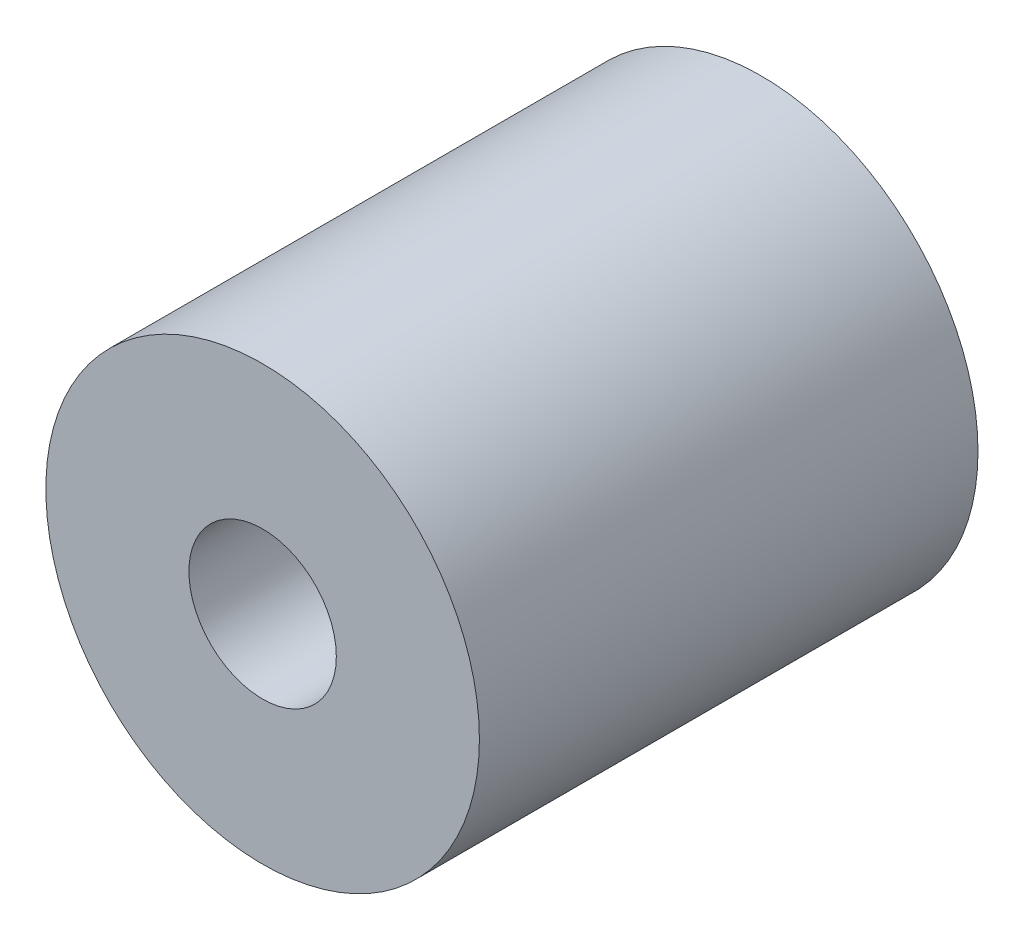
ISO-10303-21;
HEADER;
FILE_DESCRIPTION(('STEP AP214'),'2;1');
FILE_NAME('part.step','',(''),(''),'','','');
FILE_SCHEMA(('AUTOMOTIVE_DESIGN { 1 0 10303 214 1 1 1 1 }'));
ENDSEC;
DATA;
#1=APPLICATION_CONTEXT('core data for automotive mechanical design processes');
#2=APPLICATION_PROTOCOL_DEFINITION('international standard','automotive_design',2000,#1);
#3=PRODUCT_CONTEXT('',#1,'mechanical');
#4=PRODUCT('Part','Part','',(#3));
#5=PRODUCT_RELATED_PRODUCT_CATEGORY('part','',(#4));
#6=PRODUCT_DEFINITION_FORMATION('','',#4);
#7=PRODUCT_DEFINITION_CONTEXT('part definition',#1,'design');
#8=PRODUCT_DEFINITION('design','',#6,#7);
#9=PRODUCT_DEFINITION_SHAPE('','',#8);
#10=(LENGTH_UNIT() NAMED_UNIT(*) SI_UNIT(.MILLI.,.METRE.));
#11=(NAMED_UNIT(*) PLANE_ANGLE_UNIT() SI_UNIT($,.RADIAN.));
#12=(NAMED_UNIT(*) SI_UNIT($,.STERADIAN.) SOLID_ANGLE_UNIT());
#13=UNCERTAINTY_MEASURE_WITH_UNIT(LENGTH_MEASURE(1.E-05),#10,'distance_accuracy_value','');
#14=(GEOMETRIC_REPRESENTATION_CONTEXT(3) GLOBAL_UNCERTAINTY_ASSIGNED_CONTEXT((#13)) GLOBAL_UNIT_ASSIGNED_CONTEXT((#10,
#11,#12)) REPRESENTATION_CONTEXT('',''));
#15=CARTESIAN_POINT('',(0.,0.,0.));
#16=DIRECTION('',(0.,0.,1.));
#17=DIRECTION('',(1.,0.,0.));
#18=AXIS2_PLACEMENT_3D('',#15,#16,#17);
#19=CARTESIAN_POINT('',(0.,0.,11.5));
#20=DIRECTION('',(0.,0.,1.));
#21=DIRECTION('',(1.,0.,0.));
#22=AXIS2_PLACEMENT_3D('',#19,#20,#21);
#23=PLANE('',#22);
#24=CARTESIAN_POINT('',(0.,0.,11.5));
#25=DIRECTION('',(0.,0.,1.));
#26=DIRECTION('',(1.,0.,0.));
#27=AXIS2_PLACEMENT_3D('',#24,#25,#26);
#28=CIRCLE('',#27,5.);
#29=CARTESIAN_POINT('',(5.,0.,11.5));
#30=VERTEX_POINT('',#29);
#31=EDGE_CURVE('E10',#30,#30,#28,.T.);
#32=ORIENTED_EDGE('',*,*,#31,.T.);
#33=EDGE_LOOP('',(#32));
#34=FACE_BOUND('',#33,.T.);
#35=CARTESIAN_POINT('',(0.,0.,11.5));
#36=DIRECTION('',(0.,0.,1.));
#37=DIRECTION('',(1.,0.,0.));
#38=AXIS2_PLACEMENT_3D('',#35,#36,#37);
#39=CIRCLE('',#38,1.7);
#40=CARTESIAN_POINT('',(1.7,0.,11.5));
#41=VERTEX_POINT('',#40);
#42=EDGE_CURVE('E50',#41,#41,#39,.T.);
#43=ORIENTED_EDGE('',*,*,#42,.F.);
#44=EDGE_LOOP('',(#43));
#45=FACE_BOUND('',#44,.T.);
#46=ADVANCED_FACE('F39',(#34,#45),#23,.T.);
#47=CARTESIAN_POINT('',(0.,0.,0.));
#48=DIRECTION('',(0.,0.,1.));
#49=DIRECTION('',(1.,0.,0.));
#50=AXIS2_PLACEMENT_3D('',#47,#48,#49);
#51=PLANE('',#50);
#52=CARTESIAN_POINT('',(0.,0.,0.));
#53=DIRECTION('',(0.,0.,1.));
#54=DIRECTION('',(1.,0.,0.));
#55=AXIS2_PLACEMENT_3D('',#52,#53,#54);
#56=CIRCLE('',#55,5.);
#57=CARTESIAN_POINT('',(5.,0.,0.));
#58=VERTEX_POINT('',#57);
#59=EDGE_CURVE('E43',#58,#58,#56,.T.);
#60=ORIENTED_EDGE('',*,*,#59,.F.);
#61=EDGE_LOOP('',(#60));
#62=FACE_BOUND('',#61,.T.);
#63=CARTESIAN_POINT('',(0.,0.,0.));
#64=DIRECTION('',(0.,0.,1.));
#65=DIRECTION('',(1.,0.,0.));
#66=AXIS2_PLACEMENT_3D('',#63,#64,#65);
#67=CIRCLE('',#66,1.7);
#68=CARTESIAN_POINT('',(1.7,0.,0.));
#69=VERTEX_POINT('',#68);
#70=EDGE_CURVE('E52',#69,#69,#67,.T.);
#71=ORIENTED_EDGE('',*,*,#70,.T.);
#72=EDGE_LOOP('',(#71));
#73=FACE_BOUND('',#72,.T.);
#74=ADVANCED_FACE('F62',(#62,#73),#51,.F.);
#75=CARTESIAN_POINT('',(0.,0.,11.5));
#76=DIRECTION('',(0.,0.,-1.));
#77=DIRECTION('',(-1.,0.,0.));
#78=AXIS2_PLACEMENT_3D('',#75,#76,#77);
#79=CYLINDRICAL_SURFACE('',#78,5.);
#80=ORIENTED_EDGE('',*,*,#31,.F.);
#81=EDGE_LOOP('',(#80));
#82=FACE_BOUND('',#81,.T.);
#83=ORIENTED_EDGE('',*,*,#59,.T.);
#84=EDGE_LOOP('',(#83));
#85=FACE_BOUND('',#84,.T.);
#86=ADVANCED_FACE('F41',(#82,#85),#79,.T.);
#87=CARTESIAN_POINT('',(0.,0.,11.5));
#88=DIRECTION('',(0.,0.,-1.));
#89=DIRECTION('',(-1.,0.,0.));
#90=AXIS2_PLACEMENT_3D('',#87,#88,#89);
#91=CYLINDRICAL_SURFACE('',#90,1.7);
#92=ORIENTED_EDGE('',*,*,#42,.T.);
#93=EDGE_LOOP('',(#92));
#94=FACE_BOUND('',#93,.T.);
#95=ORIENTED_EDGE('',*,*,#70,.F.);
#96=EDGE_LOOP('',(#95));
#97=FACE_BOUND('',#96,.T.);
#98=ADVANCED_FACE('F58',(#94,#97),#91,.F.);
#99=CLOSED_SHELL('',(#46,#74,#86,#98));
#100=MANIFOLD_SOLID_BREP('B2',#99);
#101=ADVANCED_BREP_SHAPE_REPRESENTATION('',(#18,#100),#14);
#102=SHAPE_DEFINITION_REPRESENTATION(#9,#101);
ENDSEC;
END-ISO-10303-21;
